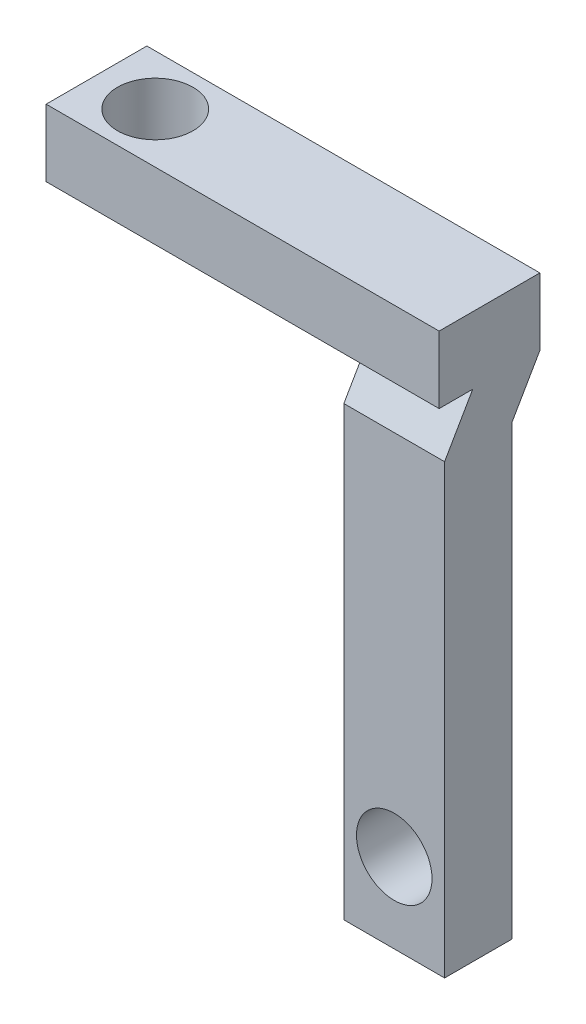
ISO-10303-21;
HEADER;
FILE_DESCRIPTION(('STEP AP214'),'2;1');
FILE_NAME('part.step','',(''),(''),'','','');
FILE_SCHEMA(('AUTOMOTIVE_DESIGN { 1 0 10303 214 1 1 1 1 }'));
ENDSEC;
DATA;
#1=APPLICATION_CONTEXT('core data for automotive mechanical design processes');
#2=APPLICATION_PROTOCOL_DEFINITION('international standard','automotive_design',2000,#1);
#3=PRODUCT_CONTEXT('',#1,'mechanical');
#4=PRODUCT('Part','Part','',(#3));
#5=PRODUCT_RELATED_PRODUCT_CATEGORY('part','',(#4));
#6=PRODUCT_DEFINITION_FORMATION('','',#4);
#7=PRODUCT_DEFINITION_CONTEXT('part definition',#1,'design');
#8=PRODUCT_DEFINITION('design','',#6,#7);
#9=PRODUCT_DEFINITION_SHAPE('','',#8);
#10=(LENGTH_UNIT() NAMED_UNIT(*) SI_UNIT(.MILLI.,.METRE.));
#11=(NAMED_UNIT(*) PLANE_ANGLE_UNIT() SI_UNIT($,.RADIAN.));
#12=(NAMED_UNIT(*) SI_UNIT($,.STERADIAN.) SOLID_ANGLE_UNIT());
#13=UNCERTAINTY_MEASURE_WITH_UNIT(LENGTH_MEASURE(1.E-05),#10,'distance_accuracy_value','');
#14=(GEOMETRIC_REPRESENTATION_CONTEXT(3) GLOBAL_UNCERTAINTY_ASSIGNED_CONTEXT((#13)) GLOBAL_UNIT_ASSIGNED_CONTEXT((#10,
#11,#12)) REPRESENTATION_CONTEXT('',''));
#15=CARTESIAN_POINT('',(0.,0.,0.));
#16=DIRECTION('',(0.,0.,1.));
#17=DIRECTION('',(1.,0.,0.));
#18=AXIS2_PLACEMENT_3D('',#15,#16,#17);
#19=CARTESIAN_POINT('',(-12.,-211.541766085023,-366.401086782107));
#20=DIRECTION('',(0.,0.500000000000003,0.866025403784437));
#21=DIRECTION('',(0.,-0.866025403784437,0.500000000000003));
#22=AXIS2_PLACEMENT_3D('',#19,#20,#21);
#23=PLANE('',#22);
#24=DIRECTION('',(0.,-0.866025403784437,0.500000000000003));
#25=VECTOR('',#24,1.);
#26=CARTESIAN_POINT('',(0.,-211.541766085023,-366.401086782107));
#27=LINE('',#26,#25);
#28=CARTESIAN_POINT('',(0.,-8.,-483.915980222628));
#29=VERTEX_POINT('',#28);
#30=CARTESIAN_POINT('',(0.,-13.8023702053557,-480.565980222628));
#31=VERTEX_POINT('',#30);
#32=EDGE_CURVE('E117',#29,#31,#27,.T.);
#33=ORIENTED_EDGE('',*,*,#32,.T.);
#34=DIRECTION('',(1.,0.,0.));
#35=VECTOR('',#34,1.);
#36=CARTESIAN_POINT('',(-12.,-13.8023702053557,-480.565980222628));
#37=LINE('',#36,#35);
#38=CARTESIAN_POINT('',(-12.,-13.8023702053557,-480.565980222628));
#39=VERTEX_POINT('',#38);
#40=EDGE_CURVE('E11',#39,#31,#37,.T.);
#41=ORIENTED_EDGE('',*,*,#40,.F.);
#42=DIRECTION('',(0.,-0.866025403784437,0.500000000000003));
#43=VECTOR('',#42,1.);
#44=CARTESIAN_POINT('',(-12.,-211.541766085023,-366.401086782107));
#45=LINE('',#44,#43);
#46=CARTESIAN_POINT('',(-12.,-8.,-483.915980222628));
#47=VERTEX_POINT('',#46);
#48=EDGE_CURVE('E53',#47,#39,#45,.T.);
#49=ORIENTED_EDGE('',*,*,#48,.F.);
#50=DIRECTION('',(1.,0.,0.));
#51=VECTOR('',#50,1.);
#52=CARTESIAN_POINT('',(-12.,-8.,-483.915980222628));
#53=LINE('',#52,#51);
#54=EDGE_CURVE('E38',#47,#29,#53,.T.);
#55=ORIENTED_EDGE('',*,*,#54,.T.);
#56=EDGE_LOOP('',(#33,#41,#49,#55));
#57=FACE_BOUND('',#56,.T.);
#58=ADVANCED_FACE('F35',(#57),#23,.F.);
#59=CARTESIAN_POINT('',(-12.,0.,-480.565980222628));
#60=DIRECTION('',(0.,0.,-1.));
#61=DIRECTION('',(-1.,0.,0.));
#62=AXIS2_PLACEMENT_3D('',#59,#60,#61);
#63=PLANE('',#62);
#64=CARTESIAN_POINT('',(-6.,-57.57,-480.565980222628));
#65=DIRECTION('',(0.,0.,-1.));
#66=DIRECTION('',(-1.,0.,0.));
#67=AXIS2_PLACEMENT_3D('',#64,#65,#66);
#68=CIRCLE('',#67,4.5);
#69=CARTESIAN_POINT('',(-1.5,-57.57,-480.565980222628));
#70=VERTEX_POINT('',#69);
#71=EDGE_CURVE('E193',#70,#70,#68,.F.);
#72=ORIENTED_EDGE('',*,*,#71,.T.);
#73=EDGE_LOOP('',(#72));
#74=FACE_BOUND('',#73,.T.);
#75=DIRECTION('',(0.,1.,0.));
#76=VECTOR('',#75,1.);
#77=CARTESIAN_POINT('',(0.,0.,-480.565980222628));
#78=LINE('',#77,#76);
#79=CARTESIAN_POINT('',(0.,-67.07,-480.565980222628));
#80=VERTEX_POINT('',#79);
#81=EDGE_CURVE('E126',#80,#31,#78,.T.);
#82=ORIENTED_EDGE('',*,*,#81,.F.);
#83=DIRECTION('',(1.,0.,0.));
#84=VECTOR('',#83,1.);
#85=CARTESIAN_POINT('',(-12.,-67.07,-480.565980222628));
#86=LINE('',#85,#84);
#87=CARTESIAN_POINT('',(-12.,-67.07,-480.565980222628));
#88=VERTEX_POINT('',#87);
#89=EDGE_CURVE('E44',#88,#80,#86,.T.);
#90=ORIENTED_EDGE('',*,*,#89,.F.);
#91=DIRECTION('',(0.,1.,0.));
#92=VECTOR('',#91,1.);
#93=CARTESIAN_POINT('',(-12.,0.,-480.565980222628));
#94=LINE('',#93,#92);
#95=EDGE_CURVE('E98',#88,#39,#94,.T.);
#96=ORIENTED_EDGE('',*,*,#95,.T.);
#97=ORIENTED_EDGE('',*,*,#40,.T.);
#98=EDGE_LOOP('',(#82,#90,#96,#97));
#99=FACE_BOUND('',#98,.T.);
#100=ADVANCED_FACE('F211',(#74,#99),#63,.T.);
#101=CARTESIAN_POINT('',(-12.,-67.0700000000008,-1.16347903533766E-13));
#102=DIRECTION('',(0.,1.,0.));
#103=DIRECTION('',(0.,0.,1.));
#104=AXIS2_PLACEMENT_3D('',#101,#102,#103);
#105=PLANE('',#104);
#106=DIRECTION('',(0.,0.,1.));
#107=VECTOR('',#106,1.);
#108=CARTESIAN_POINT('',(0.,-67.0700000000008,-1.16347903533766E-13));
#109=LINE('',#108,#107);
#110=CARTESIAN_POINT('',(0.,-67.07,-472.565980222628));
#111=VERTEX_POINT('',#110);
#112=EDGE_CURVE('E103',#80,#111,#109,.T.);
#113=ORIENTED_EDGE('',*,*,#112,.T.);
#114=DIRECTION('',(1.,0.,0.));
#115=VECTOR('',#114,1.);
#116=CARTESIAN_POINT('',(-12.,-67.07,-472.565980222628));
#117=LINE('',#116,#115);
#118=CARTESIAN_POINT('',(-12.,-67.07,-472.565980222628));
#119=VERTEX_POINT('',#118);
#120=EDGE_CURVE('E101',#119,#111,#117,.T.);
#121=ORIENTED_EDGE('',*,*,#120,.F.);
#122=DIRECTION('',(0.,0.,1.));
#123=VECTOR('',#122,1.);
#124=CARTESIAN_POINT('',(-12.,-67.0700000000008,-1.16347903533766E-13));
#125=LINE('',#124,#123);
#126=EDGE_CURVE('E92',#88,#119,#125,.T.);
#127=ORIENTED_EDGE('',*,*,#126,.F.);
#128=ORIENTED_EDGE('',*,*,#89,.T.);
#129=EDGE_LOOP('',(#113,#121,#127,#128));
#130=FACE_BOUND('',#129,.T.);
#131=ADVANCED_FACE('F102',(#130),#105,.F.);
#132=CARTESIAN_POINT('',(-12.,0.,-472.565980222628));
#133=DIRECTION('',(0.,0.,-1.));
#134=DIRECTION('',(-1.,0.,0.));
#135=AXIS2_PLACEMENT_3D('',#132,#133,#134);
#136=PLANE('',#135);
#137=CARTESIAN_POINT('',(-6.,-57.57,-472.565980222628));
#138=DIRECTION('',(0.,0.,1.));
#139=DIRECTION('',(1.,0.,0.));
#140=AXIS2_PLACEMENT_3D('',#137,#138,#139);
#141=CIRCLE('',#140,4.5);
#142=CARTESIAN_POINT('',(-1.5,-57.57,-472.565980222628));
#143=VERTEX_POINT('',#142);
#144=EDGE_CURVE('E196',#143,#143,#141,.T.);
#145=ORIENTED_EDGE('',*,*,#144,.F.);
#146=EDGE_LOOP('',(#145));
#147=FACE_BOUND('',#146,.T.);
#148=DIRECTION('',(0.,1.,0.));
#149=VECTOR('',#148,1.);
#150=CARTESIAN_POINT('',(0.,0.,-472.565980222628));
#151=LINE('',#150,#149);
#152=CARTESIAN_POINT('',(0.,-13.8023702053557,-472.565980222628));
#153=VERTEX_POINT('',#152);
#154=EDGE_CURVE('E123',#111,#153,#151,.T.);
#155=ORIENTED_EDGE('',*,*,#154,.T.);
#156=DIRECTION('',(1.,0.,0.));
#157=VECTOR('',#156,1.);
#158=CARTESIAN_POINT('',(-12.,-13.8023702053557,-472.565980222628));
#159=LINE('',#158,#157);
#160=CARTESIAN_POINT('',(-12.,-13.8023702053557,-472.565980222628));
#161=VERTEX_POINT('',#160);
#162=EDGE_CURVE('E107',#161,#153,#159,.T.);
#163=ORIENTED_EDGE('',*,*,#162,.F.);
#164=DIRECTION('',(0.,1.,0.));
#165=VECTOR('',#164,1.);
#166=CARTESIAN_POINT('',(-12.,0.,-472.565980222628));
#167=LINE('',#166,#165);
#168=EDGE_CURVE('E96',#119,#161,#167,.T.);
#169=ORIENTED_EDGE('',*,*,#168,.F.);
#170=ORIENTED_EDGE('',*,*,#120,.T.);
#171=EDGE_LOOP('',(#155,#163,#169,#170));
#172=FACE_BOUND('',#171,.T.);
#173=ADVANCED_FACE('F109',(#147,#172),#136,.F.);
#174=CARTESIAN_POINT('',(-12.,-208.077664469885,-360.401086782107));
#175=DIRECTION('',(0.,0.500000000000004,0.866025403784436));
#176=DIRECTION('',(0.,-0.866025403784436,0.500000000000004));
#177=AXIS2_PLACEMENT_3D('',#174,#175,#176);
#178=PLANE('',#177);
#179=DIRECTION('',(0.,-0.866025403784436,0.500000000000004));
#180=VECTOR('',#179,1.);
#181=CARTESIAN_POINT('',(0.,-208.077664469885,-360.401086782107));
#182=LINE('',#181,#180);
#183=CARTESIAN_POINT('',(0.,-8.,-475.915980222628));
#184=VERTEX_POINT('',#183);
#185=EDGE_CURVE('E119',#184,#153,#182,.T.);
#186=ORIENTED_EDGE('',*,*,#185,.F.);
#187=DIRECTION('',(1.,0.,0.));
#188=VECTOR('',#187,1.);
#189=CARTESIAN_POINT('',(-12.,-8.,-475.915980222628));
#190=LINE('',#189,#188);
#191=CARTESIAN_POINT('',(-12.,-8.,-475.915980222628));
#192=VERTEX_POINT('',#191);
#193=EDGE_CURVE('E130',#192,#184,#190,.T.);
#194=ORIENTED_EDGE('',*,*,#193,.F.);
#195=DIRECTION('',(0.,-0.866025403784436,0.500000000000004));
#196=VECTOR('',#195,1.);
#197=CARTESIAN_POINT('',(-12.,-208.077664469885,-360.401086782107));
#198=LINE('',#197,#196);
#199=EDGE_CURVE('E111',#192,#161,#198,.T.);
#200=ORIENTED_EDGE('',*,*,#199,.T.);
#201=ORIENTED_EDGE('',*,*,#162,.T.);
#202=EDGE_LOOP('',(#186,#194,#200,#201));
#203=FACE_BOUND('',#202,.T.);
#204=ADVANCED_FACE('F204',(#203),#178,.T.);
#205=CARTESIAN_POINT('',(-12.,0.,0.));
#206=DIRECTION('',(1.,0.,0.));
#207=DIRECTION('',(0.,0.,-1.));
#208=AXIS2_PLACEMENT_3D('',#205,#206,#207);
#209=PLANE('',#208);
#210=ORIENTED_EDGE('',*,*,#48,.T.);
#211=ORIENTED_EDGE('',*,*,#95,.F.);
#212=ORIENTED_EDGE('',*,*,#126,.T.);
#213=ORIENTED_EDGE('',*,*,#168,.T.);
#214=ORIENTED_EDGE('',*,*,#199,.F.);
#215=DIRECTION('',(0.,0.,-1.));
#216=VECTOR('',#215,1.);
#217=CARTESIAN_POINT('',(-12.,-8.0000000000001,0.));
#218=LINE('',#217,#216);
#219=EDGE_CURVE('E83',#192,#47,#218,.T.);
#220=ORIENTED_EDGE('',*,*,#219,.T.);
#221=EDGE_LOOP('',(#210,#211,#212,#213,#214,#220));
#222=FACE_BOUND('',#221,.T.);
#223=ADVANCED_FACE('F94',(#222),#209,.F.);
#224=CARTESIAN_POINT('',(0.,0.,0.));
#225=DIRECTION('',(1.,0.,0.));
#226=DIRECTION('',(0.,0.,-1.));
#227=AXIS2_PLACEMENT_3D('',#224,#225,#226);
#228=PLANE('',#227);
#229=ORIENTED_EDGE('',*,*,#32,.F.);
#230=DIRECTION('',(0.,1.,0.));
#231=VECTOR('',#230,1.);
#232=CARTESIAN_POINT('',(0.,0.,-483.915980222628));
#233=LINE('',#232,#231);
#234=CARTESIAN_POINT('',(0.,0.,-483.915980222628));
#235=VERTEX_POINT('',#234);
#236=EDGE_CURVE('E147',#29,#235,#233,.T.);
#237=ORIENTED_EDGE('',*,*,#236,.T.);
#238=DIRECTION('',(0.,0.,-1.));
#239=VECTOR('',#238,1.);
#240=CARTESIAN_POINT('',(0.,0.,0.));
#241=LINE('',#240,#239);
#242=CARTESIAN_POINT('',(0.,0.,-471.915980222628));
#243=VERTEX_POINT('',#242);
#244=EDGE_CURVE('E154',#243,#235,#241,.T.);
#245=ORIENTED_EDGE('',*,*,#244,.F.);
#246=DIRECTION('',(0.,-1.,0.));
#247=VECTOR('',#246,1.);
#248=CARTESIAN_POINT('',(0.,0.,-471.915980222628));
#249=LINE('',#248,#247);
#250=CARTESIAN_POINT('',(0.,-8.,-471.915980222628));
#251=VERTEX_POINT('',#250);
#252=EDGE_CURVE('E157',#243,#251,#249,.T.);
#253=ORIENTED_EDGE('',*,*,#252,.T.);
#254=DIRECTION('',(0.,0.,-1.));
#255=VECTOR('',#254,1.);
#256=CARTESIAN_POINT('',(0.,-8.,0.));
#257=LINE('',#256,#255);
#258=EDGE_CURVE('E155',#251,#184,#257,.T.);
#259=ORIENTED_EDGE('',*,*,#258,.T.);
#260=ORIENTED_EDGE('',*,*,#185,.T.);
#261=ORIENTED_EDGE('',*,*,#154,.F.);
#262=ORIENTED_EDGE('',*,*,#112,.F.);
#263=ORIENTED_EDGE('',*,*,#81,.T.);
#264=EDGE_LOOP('',(#229,#237,#245,#253,#259,#260,#261,#262,#263));
#265=FACE_BOUND('',#264,.T.);
#266=ADVANCED_FACE('F144',(#265),#228,.T.);
#267=CARTESIAN_POINT('',(-46.82,-8.,0.));
#268=DIRECTION('',(0.,-1.,0.));
#269=DIRECTION('',(0.,0.,-1.));
#270=AXIS2_PLACEMENT_3D('',#267,#268,#269);
#271=PLANE('',#270);
#272=CARTESIAN_POINT('',(-39.82,-8.,-477.915980222628));
#273=DIRECTION('',(0.,-1.,0.));
#274=DIRECTION('',(0.,0.,-1.));
#275=AXIS2_PLACEMENT_3D('',#272,#273,#274);
#276=CIRCLE('',#275,4.5);
#277=CARTESIAN_POINT('',(-39.82,-8.,-482.415980222628));
#278=VERTEX_POINT('',#277);
#279=EDGE_CURVE('E190',#278,#278,#276,.T.);
#280=ORIENTED_EDGE('',*,*,#279,.F.);
#281=EDGE_LOOP('',(#280));
#282=FACE_BOUND('',#281,.T.);
#283=ORIENTED_EDGE('',*,*,#219,.F.);
#284=ORIENTED_EDGE('',*,*,#193,.T.);
#285=ORIENTED_EDGE('',*,*,#258,.F.);
#286=DIRECTION('',(1.,0.,0.));
#287=VECTOR('',#286,1.);
#288=CARTESIAN_POINT('',(-46.82,-8.,-471.915980222628));
#289=LINE('',#288,#287);
#290=CARTESIAN_POINT('',(-46.82,-8.,-471.915980222628));
#291=VERTEX_POINT('',#290);
#292=EDGE_CURVE('E120',#291,#251,#289,.T.);
#293=ORIENTED_EDGE('',*,*,#292,.F.);
#294=DIRECTION('',(0.,0.,-1.));
#295=VECTOR('',#294,1.);
#296=CARTESIAN_POINT('',(-46.82,-8.,0.));
#297=LINE('',#296,#295);
#298=CARTESIAN_POINT('',(-46.82,-8.,-483.915980222628));
#299=VERTEX_POINT('',#298);
#300=EDGE_CURVE('E165',#291,#299,#297,.T.);
#301=ORIENTED_EDGE('',*,*,#300,.T.);
#302=DIRECTION('',(1.,0.,0.));
#303=VECTOR('',#302,1.);
#304=CARTESIAN_POINT('',(-46.82,-8.,-483.915980222628));
#305=LINE('',#304,#303);
#306=EDGE_CURVE('E172',#299,#47,#305,.T.);
#307=ORIENTED_EDGE('',*,*,#306,.T.);
#308=EDGE_LOOP('',(#283,#284,#285,#293,#301,#307));
#309=FACE_BOUND('',#308,.T.);
#310=ADVANCED_FACE('F224',(#282,#309),#271,.T.);
#311=CARTESIAN_POINT('',(-46.82,0.,-471.915980222628));
#312=DIRECTION('',(0.,0.,1.));
#313=DIRECTION('',(1.,0.,0.));
#314=AXIS2_PLACEMENT_3D('',#311,#312,#313);
#315=PLANE('',#314);
#316=ORIENTED_EDGE('',*,*,#252,.F.);
#317=DIRECTION('',(1.,0.,0.));
#318=VECTOR('',#317,1.);
#319=CARTESIAN_POINT('',(-46.82,0.,-471.915980222628));
#320=LINE('',#319,#318);
#321=CARTESIAN_POINT('',(-46.82,0.,-471.915980222628));
#322=VERTEX_POINT('',#321);
#323=EDGE_CURVE('E168',#322,#243,#320,.T.);
#324=ORIENTED_EDGE('',*,*,#323,.F.);
#325=DIRECTION('',(0.,-1.,0.));
#326=VECTOR('',#325,1.);
#327=CARTESIAN_POINT('',(-46.82,0.,-471.915980222628));
#328=LINE('',#327,#326);
#329=EDGE_CURVE('E174',#322,#291,#328,.T.);
#330=ORIENTED_EDGE('',*,*,#329,.T.);
#331=ORIENTED_EDGE('',*,*,#292,.T.);
#332=EDGE_LOOP('',(#316,#324,#330,#331));
#333=FACE_BOUND('',#332,.T.);
#334=ADVANCED_FACE('F229',(#333),#315,.T.);
#335=CARTESIAN_POINT('',(-46.82,0.,0.));
#336=DIRECTION('',(0.,-1.,0.));
#337=DIRECTION('',(0.,0.,-1.));
#338=AXIS2_PLACEMENT_3D('',#335,#336,#337);
#339=PLANE('',#338);
#340=CARTESIAN_POINT('',(-39.82,0.,-477.915980222628));
#341=DIRECTION('',(0.,-1.,0.));
#342=DIRECTION('',(0.,0.,-1.));
#343=AXIS2_PLACEMENT_3D('',#340,#341,#342);
#344=CIRCLE('',#343,4.5);
#345=CARTESIAN_POINT('',(-39.82,0.,-482.415980222628));
#346=VERTEX_POINT('',#345);
#347=EDGE_CURVE('E159',#346,#346,#344,.F.);
#348=ORIENTED_EDGE('',*,*,#347,.F.);
#349=EDGE_LOOP('',(#348));
#350=FACE_BOUND('',#349,.T.);
#351=ORIENTED_EDGE('',*,*,#244,.T.);
#352=DIRECTION('',(1.,0.,0.));
#353=VECTOR('',#352,1.);
#354=CARTESIAN_POINT('',(-46.82,0.,-483.915980222628));
#355=LINE('',#354,#353);
#356=CARTESIAN_POINT('',(-46.82,0.,-483.915980222628));
#357=VERTEX_POINT('',#356);
#358=EDGE_CURVE('E152',#357,#235,#355,.T.);
#359=ORIENTED_EDGE('',*,*,#358,.F.);
#360=DIRECTION('',(0.,0.,-1.));
#361=VECTOR('',#360,1.);
#362=CARTESIAN_POINT('',(-46.82,0.,0.));
#363=LINE('',#362,#361);
#364=EDGE_CURVE('E177',#322,#357,#363,.T.);
#365=ORIENTED_EDGE('',*,*,#364,.F.);
#366=ORIENTED_EDGE('',*,*,#323,.T.);
#367=EDGE_LOOP('',(#351,#359,#365,#366));
#368=FACE_BOUND('',#367,.T.);
#369=ADVANCED_FACE('F234',(#350,#368),#339,.F.);
#370=CARTESIAN_POINT('',(-46.82,0.,-483.915980222628));
#371=DIRECTION('',(0.,0.,-1.));
#372=DIRECTION('',(-1.,0.,0.));
#373=AXIS2_PLACEMENT_3D('',#370,#371,#372);
#374=PLANE('',#373);
#375=ORIENTED_EDGE('',*,*,#236,.F.);
#376=ORIENTED_EDGE('',*,*,#54,.F.);
#377=ORIENTED_EDGE('',*,*,#306,.F.);
#378=DIRECTION('',(0.,1.,0.));
#379=VECTOR('',#378,1.);
#380=CARTESIAN_POINT('',(-46.82,0.,-483.915980222628));
#381=LINE('',#380,#379);
#382=EDGE_CURVE('E183',#299,#357,#381,.T.);
#383=ORIENTED_EDGE('',*,*,#382,.T.);
#384=ORIENTED_EDGE('',*,*,#358,.T.);
#385=EDGE_LOOP('',(#375,#376,#377,#383,#384));
#386=FACE_BOUND('',#385,.T.);
#387=ADVANCED_FACE('F149',(#386),#374,.T.);
#388=CARTESIAN_POINT('',(-46.82,0.,0.));
#389=DIRECTION('',(1.,0.,0.));
#390=DIRECTION('',(0.,0.,-1.));
#391=AXIS2_PLACEMENT_3D('',#388,#389,#390);
#392=PLANE('',#391);
#393=ORIENTED_EDGE('',*,*,#300,.F.);
#394=ORIENTED_EDGE('',*,*,#329,.F.);
#395=ORIENTED_EDGE('',*,*,#364,.T.);
#396=ORIENTED_EDGE('',*,*,#382,.F.);
#397=EDGE_LOOP('',(#393,#394,#395,#396));
#398=FACE_BOUND('',#397,.T.);
#399=ADVANCED_FACE('F233',(#398),#392,.F.);
#400=CARTESIAN_POINT('',(-39.82,0.000999999999999265,-477.915980222628));
#401=DIRECTION('',(0.,-1.,0.));
#402=DIRECTION('',(0.,0.,-1.));
#403=AXIS2_PLACEMENT_3D('',#400,#401,#402);
#404=CYLINDRICAL_SURFACE('',#403,4.5);
#405=ORIENTED_EDGE('',*,*,#279,.T.);
#406=EDGE_LOOP('',(#405));
#407=FACE_BOUND('',#406,.T.);
#408=ORIENTED_EDGE('',*,*,#347,.T.);
#409=EDGE_LOOP('',(#408));
#410=FACE_BOUND('',#409,.T.);
#411=ADVANCED_FACE('F242',(#407,#410),#404,.F.);
#412=CARTESIAN_POINT('',(-6.,-57.57,-493.293902283986));
#413=DIRECTION('',(0.,0.,1.));
#414=DIRECTION('',(1.,0.,0.));
#415=AXIS2_PLACEMENT_3D('',#412,#413,#414);
#416=CYLINDRICAL_SURFACE('',#415,4.5);
#417=CARTESIAN_POINT('',(-1.5,-57.57,-472.565980222628));
#418=CARTESIAN_POINT('',(-1.5,-57.57,-472.649313555961));
#419=CARTESIAN_POINT('',(-1.5,-57.57,-472.732646889294));
#420=CARTESIAN_POINT('',(-1.5,-57.57,-472.899313555961));
#421=CARTESIAN_POINT('',(-1.5,-57.57,-472.982646889294));
#422=CARTESIAN_POINT('',(-1.5,-57.57,-473.149313555961));
#423=CARTESIAN_POINT('',(-1.5,-57.57,-473.232646889294));
#424=CARTESIAN_POINT('',(-1.5,-57.57,-473.399313555961));
#425=CARTESIAN_POINT('',(-1.5,-57.57,-473.482646889294));
#426=CARTESIAN_POINT('',(-1.5,-57.57,-473.649313555961));
#427=CARTESIAN_POINT('',(-1.5,-57.57,-473.732646889294));
#428=CARTESIAN_POINT('',(-1.5,-57.57,-473.899313555961));
#429=CARTESIAN_POINT('',(-1.5,-57.57,-473.982646889294));
#430=CARTESIAN_POINT('',(-1.5,-57.57,-474.149313555961));
#431=CARTESIAN_POINT('',(-1.5,-57.57,-474.232646889294));
#432=CARTESIAN_POINT('',(-1.5,-57.57,-474.399313555961));
#433=CARTESIAN_POINT('',(-1.5,-57.57,-474.482646889294));
#434=CARTESIAN_POINT('',(-1.5,-57.57,-474.649313555961));
#435=CARTESIAN_POINT('',(-1.5,-57.57,-474.732646889294));
#436=CARTESIAN_POINT('',(-1.5,-57.57,-474.899313555961));
#437=CARTESIAN_POINT('',(-1.5,-57.57,-474.982646889294));
#438=CARTESIAN_POINT('',(-1.5,-57.57,-475.149313555961));
#439=CARTESIAN_POINT('',(-1.5,-57.57,-475.232646889294));
#440=CARTESIAN_POINT('',(-1.5,-57.57,-475.399313555961));
#441=CARTESIAN_POINT('',(-1.5,-57.57,-475.482646889294));
#442=CARTESIAN_POINT('',(-1.5,-57.57,-475.649313555961));
#443=CARTESIAN_POINT('',(-1.5,-57.57,-475.732646889294));
#444=CARTESIAN_POINT('',(-1.5,-57.57,-475.899313555961));
#445=CARTESIAN_POINT('',(-1.5,-57.57,-475.982646889294));
#446=CARTESIAN_POINT('',(-1.5,-57.57,-476.149313555961));
#447=CARTESIAN_POINT('',(-1.5,-57.57,-476.232646889294));
#448=CARTESIAN_POINT('',(-1.5,-57.57,-476.399313555961));
#449=CARTESIAN_POINT('',(-1.5,-57.57,-476.482646889294));
#450=CARTESIAN_POINT('',(-1.5,-57.57,-476.649313555961));
#451=CARTESIAN_POINT('',(-1.5,-57.57,-476.732646889294));
#452=CARTESIAN_POINT('',(-1.5,-57.57,-476.899313555961));
#453=CARTESIAN_POINT('',(-1.5,-57.57,-476.982646889294));
#454=CARTESIAN_POINT('',(-1.5,-57.57,-477.149313555961));
#455=CARTESIAN_POINT('',(-1.5,-57.57,-477.232646889294));
#456=CARTESIAN_POINT('',(-1.5,-57.57,-477.399313555961));
#457=CARTESIAN_POINT('',(-1.5,-57.57,-477.482646889294));
#458=CARTESIAN_POINT('',(-1.5,-57.57,-477.649313555961));
#459=CARTESIAN_POINT('',(-1.5,-57.57,-477.732646889294));
#460=CARTESIAN_POINT('',(-1.5,-57.57,-477.899313555961));
#461=CARTESIAN_POINT('',(-1.5,-57.57,-477.982646889294));
#462=CARTESIAN_POINT('',(-1.5,-57.57,-478.149313555961));
#463=CARTESIAN_POINT('',(-1.5,-57.57,-478.232646889294));
#464=CARTESIAN_POINT('',(-1.5,-57.57,-478.399313555961));
#465=CARTESIAN_POINT('',(-1.5,-57.57,-478.482646889294));
#466=CARTESIAN_POINT('',(-1.5,-57.57,-478.649313555961));
#467=CARTESIAN_POINT('',(-1.5,-57.57,-478.732646889294));
#468=CARTESIAN_POINT('',(-1.5,-57.57,-478.899313555961));
#469=CARTESIAN_POINT('',(-1.5,-57.57,-478.982646889294));
#470=CARTESIAN_POINT('',(-1.5,-57.57,-479.149313555961));
#471=CARTESIAN_POINT('',(-1.5,-57.57,-479.232646889294));
#472=CARTESIAN_POINT('',(-1.5,-57.57,-479.399313555961));
#473=CARTESIAN_POINT('',(-1.5,-57.57,-479.482646889294));
#474=CARTESIAN_POINT('',(-1.5,-57.57,-479.649313555961));
#475=CARTESIAN_POINT('',(-1.5,-57.57,-479.732646889294));
#476=CARTESIAN_POINT('',(-1.5,-57.57,-479.899313555961));
#477=CARTESIAN_POINT('',(-1.5,-57.57,-479.982646889294));
#478=CARTESIAN_POINT('',(-1.5,-57.57,-480.149313555961));
#479=CARTESIAN_POINT('',(-1.5,-57.57,-480.232646889294));
#480=CARTESIAN_POINT('',(-1.5,-57.57,-480.399313555961));
#481=CARTESIAN_POINT('',(-1.5,-57.57,-480.482646889294));
#482=CARTESIAN_POINT('',(-1.5,-57.57,-480.565980222628));
#483=B_SPLINE_CURVE_WITH_KNOTS('',3,(#417,#418,#419,#420,#421,#422,#423,#424,#425,#426,#427,
#428,#429,#430,#431,#432,#433,#434,#435,#436,#437,#438,#439,#440,#441,#442,#443,#444,#445,#446,
#447,#448,#449,#450,#451,#452,#453,#454,#455,#456,#457,#458,#459,#460,#461,#462,#463,#464,#465,
#466,#467,#468,#469,#470,#471,#472,#473,#474,#475,#476,#477,#478,#479,#480,#481,#482),
.UNSPECIFIED.,.F.,.F.,(4,2,2,2,2,2,2,2,2,2,2,2,2,2,2,2,2,2,2,2,2,2,2,2,2,2,2,2,2,2,2,2,4),(0.,
0.250000000000028,0.5,0.750000000000028,1.,1.25000000000003,1.5,1.75000000000003,2.,
2.25000000000003,2.5,2.75000000000003,3.,3.25000000000003,3.5,3.75000000000003,4.,
4.24999999999998,4.5,4.74999999999998,5.,5.24999999999998,5.50000000000001,5.74999999999998,
6.00000000000001,6.24999999999998,6.50000000000001,6.74999999999998,7.00000000000001,
7.24999999999998,7.50000000000001,7.74999999999998,8.00000000000001),.UNSPECIFIED.);
#484=EDGE_CURVE('BSEAM200',#143,#70,#483,.T.);
#485=ORIENTED_EDGE('',*,*,#144,.T.);
#486=ORIENTED_EDGE('',*,*,#71,.F.);
#487=ORIENTED_EDGE('',*,*,#484,.T.);
#488=ORIENTED_EDGE('',*,*,#484,.F.);
#489=EDGE_LOOP('',(#485,#487,#486,#488));
#490=FACE_BOUND('',#489,.T.);
#491=ADVANCED_FACE('F200',(#490),#416,.F.);
#492=CLOSED_SHELL('',(#58,#100,#131,#173,#204,#223,#266,#310,#334,#369,#387,#399,#411,#491));
#493=MANIFOLD_SOLID_BREP('B2',#492);
#494=ADVANCED_BREP_SHAPE_REPRESENTATION('',(#18,#493),#14);
#495=SHAPE_DEFINITION_REPRESENTATION(#9,#494);
ENDSEC;
END-ISO-10303-21;
